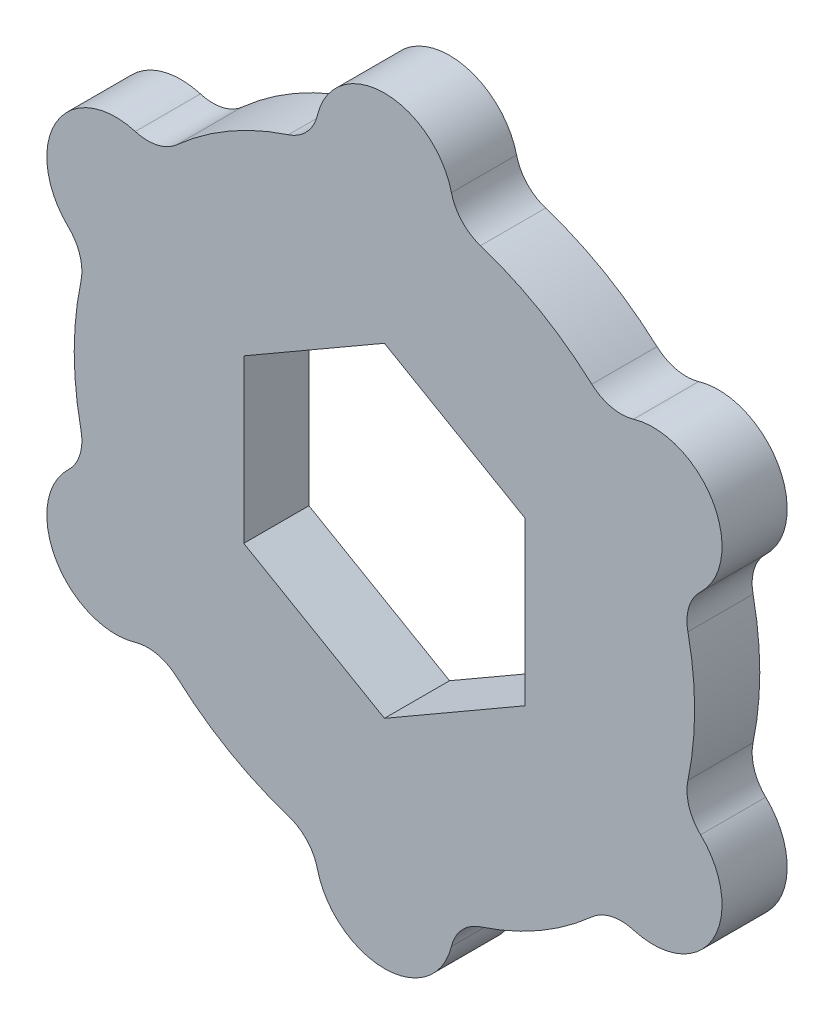
ISO-10303-21;
HEADER;
FILE_DESCRIPTION(('STEP AP214'),'2;1');
FILE_NAME('part.step','',(''),(''),'','','');
FILE_SCHEMA(('AUTOMOTIVE_DESIGN { 1 0 10303 214 1 1 1 1 }'));
ENDSEC;
DATA;
#1=APPLICATION_CONTEXT('core data for automotive mechanical design processes');
#2=APPLICATION_PROTOCOL_DEFINITION('international standard','automotive_design',2000,#1);
#3=PRODUCT_CONTEXT('',#1,'mechanical');
#4=PRODUCT('Part','Part','',(#3));
#5=PRODUCT_RELATED_PRODUCT_CATEGORY('part','',(#4));
#6=PRODUCT_DEFINITION_FORMATION('','',#4);
#7=PRODUCT_DEFINITION_CONTEXT('part definition',#1,'design');
#8=PRODUCT_DEFINITION('design','',#6,#7);
#9=PRODUCT_DEFINITION_SHAPE('','',#8);
#10=(LENGTH_UNIT() NAMED_UNIT(*) SI_UNIT(.MILLI.,.METRE.));
#11=(NAMED_UNIT(*) PLANE_ANGLE_UNIT() SI_UNIT($,.RADIAN.));
#12=(NAMED_UNIT(*) SI_UNIT($,.STERADIAN.) SOLID_ANGLE_UNIT());
#13=UNCERTAINTY_MEASURE_WITH_UNIT(LENGTH_MEASURE(1.E-05),#10,'distance_accuracy_value','');
#14=(GEOMETRIC_REPRESENTATION_CONTEXT(3) GLOBAL_UNCERTAINTY_ASSIGNED_CONTEXT((#13)) GLOBAL_UNIT_ASSIGNED_CONTEXT((#10,
#11,#12)) REPRESENTATION_CONTEXT('',''));
#15=CARTESIAN_POINT('',(0.,0.,0.));
#16=DIRECTION('',(0.,0.,1.));
#17=DIRECTION('',(1.,0.,0.));
#18=AXIS2_PLACEMENT_3D('',#15,#16,#17);
#19=CARTESIAN_POINT('',(0.,7.14375,1.499997));
#20=DIRECTION('',(0.,0.,1.));
#21=DIRECTION('',(1.,0.,0.));
#22=AXIS2_PLACEMENT_3D('',#19,#20,#21);
#23=PLANE('',#22);
#24=CARTESIAN_POINT('',(12.3733379565702,7.14375,1.499997));
#25=DIRECTION('',(0.,0.,1.));
#26=DIRECTION('',(1.,0.,0.));
#27=AXIS2_PLACEMENT_3D('',#24,#25,#26);
#28=CIRCLE('',#27,3.175);
#29=CARTESIAN_POINT('',(14.5612356301264,4.84293954060812,1.499997));
#30=VERTEX_POINT('',#29);
#31=CARTESIAN_POINT('',(11.474726486222,10.1889301958765,1.499997));
#32=VERTEX_POINT('',#31);
#33=EDGE_CURVE('E362',#30,#32,#28,.T.);
#34=ORIENTED_EDGE('',*,*,#33,.T.);
#35=CARTESIAN_POINT('',(10.9032095910805,12.125664800454,1.499997));
#36=DIRECTION('',(0.,0.,1.));
#37=DIRECTION('',(1.,0.,0.));
#38=AXIS2_PLACEMENT_3D('',#35,#36,#37);
#39=CIRCLE('',#38,2.0193);
#40=CARTESIAN_POINT('',(9.55304578657757,10.6241221966595,1.499997));
#41=VERTEX_POINT('',#40);
#42=EDGE_CURVE('E497',#32,#41,#39,.F.);
#43=ORIENTED_EDGE('',*,*,#42,.T.);
#44=CARTESIAN_POINT('',(0.,0.,1.499997));
#45=DIRECTION('',(0.,0.,1.));
#46=DIRECTION('',(1.,0.,0.));
#47=AXIS2_PLACEMENT_3D('',#44,#45,#46);
#48=CIRCLE('',#47,14.2875);
#49=CARTESIAN_POINT('',(4.42423682192846,13.5852414330218,1.499997));
#50=VERTEX_POINT('',#49);
#51=EDGE_CURVE('E319',#41,#50,#48,.T.);
#52=ORIENTED_EDGE('',*,*,#51,.T.);
#53=CARTESIAN_POINT('',(5.04952895942768,15.5052888888889,1.499997));
#54=DIRECTION('',(0.,0.,1.));
#55=DIRECTION('',(1.,0.,0.));
#56=AXIS2_PLACEMENT_3D('',#53,#54,#55);
#57=CIRCLE('',#56,2.0193);
#58=CARTESIAN_POINT('',(3.08650914390445,15.0318697364846,1.499997));
#59=VERTEX_POINT('',#58);
#60=EDGE_CURVE('E68',#50,#59,#57,.F.);
#61=ORIENTED_EDGE('',*,*,#60,.T.);
#62=CARTESIAN_POINT('',(0.,14.2875,1.499997));
#63=DIRECTION('',(0.,0.,1.));
#64=DIRECTION('',(1.,0.,0.));
#65=AXIS2_PLACEMENT_3D('',#62,#63,#64);
#66=CIRCLE('',#65,3.175);
#67=CARTESIAN_POINT('',(-3.08650914390445,15.0318697364846,1.499997));
#68=VERTEX_POINT('',#67);
#69=EDGE_CURVE('E322',#59,#68,#66,.T.);
#70=ORIENTED_EDGE('',*,*,#69,.T.);
#71=CARTESIAN_POINT('',(-5.04952895942768,15.5052888888889,1.499997));
#72=DIRECTION('',(0.,0.,1.));
#73=DIRECTION('',(1.,0.,0.));
#74=AXIS2_PLACEMENT_3D('',#71,#72,#73);
#75=CIRCLE('',#74,2.0193);
#76=CARTESIAN_POINT('',(-4.42423682192846,13.5852414330218,1.499997));
#77=VERTEX_POINT('',#76);
#78=EDGE_CURVE('E551',#68,#77,#75,.F.);
#79=ORIENTED_EDGE('',*,*,#78,.T.);
#80=CARTESIAN_POINT('',(0.,0.,1.499997));
#81=DIRECTION('',(0.,0.,1.));
#82=DIRECTION('',(1.,0.,0.));
#83=AXIS2_PLACEMENT_3D('',#80,#81,#82);
#84=CIRCLE('',#83,14.2875);
#85=CARTESIAN_POINT('',(-9.55304578657758,10.6241221966595,1.499997));
#86=VERTEX_POINT('',#85);
#87=EDGE_CURVE('E326',#77,#86,#84,.T.);
#88=ORIENTED_EDGE('',*,*,#87,.T.);
#89=CARTESIAN_POINT('',(-10.9032095910805,12.125664800454,1.499997));
#90=DIRECTION('',(0.,0.,1.));
#91=DIRECTION('',(1.,0.,0.));
#92=AXIS2_PLACEMENT_3D('',#89,#90,#91);
#93=CIRCLE('',#92,2.0193);
#94=CARTESIAN_POINT('',(-11.474726486222,10.1889301958765,1.499997));
#95=VERTEX_POINT('',#94);
#96=EDGE_CURVE('E11',#86,#95,#93,.F.);
#97=ORIENTED_EDGE('',*,*,#96,.T.);
#98=CARTESIAN_POINT('',(-12.3733379565702,7.14374999999999,1.499997));
#99=DIRECTION('',(0.,0.,1.));
#100=DIRECTION('',(1.,0.,0.));
#101=AXIS2_PLACEMENT_3D('',#98,#99,#100);
#102=CIRCLE('',#101,3.175);
#103=CARTESIAN_POINT('',(-14.5612356301264,4.8429395406081,1.499997));
#104=VERTEX_POINT('',#103);
#105=EDGE_CURVE('E330',#95,#104,#102,.T.);
#106=ORIENTED_EDGE('',*,*,#105,.T.);
#107=CARTESIAN_POINT('',(-15.9527385505082,3.37962408843486,1.499997));
#108=DIRECTION('',(0.,0.,1.));
#109=DIRECTION('',(1.,0.,0.));
#110=AXIS2_PLACEMENT_3D('',#107,#108,#109);
#111=CIRCLE('',#110,2.0193);
#112=CARTESIAN_POINT('',(-13.977282608506,2.96111923636232,1.499997));
#113=VERTEX_POINT('',#112);
#114=EDGE_CURVE('E545',#104,#113,#111,.F.);
#115=ORIENTED_EDGE('',*,*,#114,.T.);
#116=CARTESIAN_POINT('',(0.,0.,1.499997));
#117=DIRECTION('',(0.,0.,1.));
#118=DIRECTION('',(1.,0.,0.));
#119=AXIS2_PLACEMENT_3D('',#116,#117,#118);
#120=CIRCLE('',#119,14.2875);
#121=CARTESIAN_POINT('',(-13.977282608506,-2.96111923636234,1.499997));
#122=VERTEX_POINT('',#121);
#123=EDGE_CURVE('E334',#113,#122,#120,.T.);
#124=ORIENTED_EDGE('',*,*,#123,.T.);
#125=CARTESIAN_POINT('',(-15.9527385505082,-3.37962408843488,1.499997));
#126=DIRECTION('',(0.,0.,1.));
#127=DIRECTION('',(1.,0.,0.));
#128=AXIS2_PLACEMENT_3D('',#125,#126,#127);
#129=CIRCLE('',#128,2.0193);
#130=CARTESIAN_POINT('',(-14.5612356301264,-4.84293954060812,1.499997));
#131=VERTEX_POINT('',#130);
#132=EDGE_CURVE('E539',#122,#131,#129,.F.);
#133=ORIENTED_EDGE('',*,*,#132,.T.);
#134=CARTESIAN_POINT('',(-12.3733379565702,-7.14375000000001,1.499997));
#135=DIRECTION('',(0.,0.,1.));
#136=DIRECTION('',(1.,0.,0.));
#137=AXIS2_PLACEMENT_3D('',#134,#135,#136);
#138=CIRCLE('',#137,3.175);
#139=CARTESIAN_POINT('',(-11.474726486222,-10.1889301958765,1.499997));
#140=VERTEX_POINT('',#139);
#141=EDGE_CURVE('E338',#131,#140,#138,.T.);
#142=ORIENTED_EDGE('',*,*,#141,.T.);
#143=CARTESIAN_POINT('',(-10.9032095910805,-12.125664800454,1.499997));
#144=DIRECTION('',(0.,0.,1.));
#145=DIRECTION('',(1.,0.,0.));
#146=AXIS2_PLACEMENT_3D('',#143,#144,#145);
#147=CIRCLE('',#146,2.0193);
#148=CARTESIAN_POINT('',(-9.55304578657757,-10.6241221966595,1.499997));
#149=VERTEX_POINT('',#148);
#150=EDGE_CURVE('E533',#140,#149,#147,.F.);
#151=ORIENTED_EDGE('',*,*,#150,.T.);
#152=CARTESIAN_POINT('',(0.,0.,1.499997));
#153=DIRECTION('',(0.,0.,1.));
#154=DIRECTION('',(1.,0.,0.));
#155=AXIS2_PLACEMENT_3D('',#152,#153,#154);
#156=CIRCLE('',#155,14.2875);
#157=CARTESIAN_POINT('',(-4.42423682192845,-13.5852414330218,1.499997));
#158=VERTEX_POINT('',#157);
#159=EDGE_CURVE('E342',#149,#158,#156,.T.);
#160=ORIENTED_EDGE('',*,*,#159,.T.);
#161=CARTESIAN_POINT('',(-5.04952895942767,-15.5052888888889,1.499997));
#162=DIRECTION('',(0.,0.,1.));
#163=DIRECTION('',(1.,0.,0.));
#164=AXIS2_PLACEMENT_3D('',#161,#162,#163);
#165=CIRCLE('',#164,2.0193);
#166=CARTESIAN_POINT('',(-3.08650914390445,-15.0318697364847,1.499997));
#167=VERTEX_POINT('',#166);
#168=EDGE_CURVE('E527',#158,#167,#165,.F.);
#169=ORIENTED_EDGE('',*,*,#168,.T.);
#170=CARTESIAN_POINT('',(0.,-14.2875,1.499997));
#171=DIRECTION('',(0.,0.,1.));
#172=DIRECTION('',(1.,0.,0.));
#173=AXIS2_PLACEMENT_3D('',#170,#171,#172);
#174=CIRCLE('',#173,3.175);
#175=CARTESIAN_POINT('',(3.08650914390445,-15.0318697364846,1.499997));
#176=VERTEX_POINT('',#175);
#177=EDGE_CURVE('E346',#167,#176,#174,.T.);
#178=ORIENTED_EDGE('',*,*,#177,.T.);
#179=CARTESIAN_POINT('',(5.04952895942768,-15.5052888888889,1.499997));
#180=DIRECTION('',(0.,0.,1.));
#181=DIRECTION('',(1.,0.,0.));
#182=AXIS2_PLACEMENT_3D('',#179,#180,#181);
#183=CIRCLE('',#182,2.0193);
#184=CARTESIAN_POINT('',(4.42423682192846,-13.5852414330218,1.499997));
#185=VERTEX_POINT('',#184);
#186=EDGE_CURVE('E521',#176,#185,#183,.F.);
#187=ORIENTED_EDGE('',*,*,#186,.T.);
#188=CARTESIAN_POINT('',(0.,0.,1.499997));
#189=DIRECTION('',(0.,0.,1.));
#190=DIRECTION('',(1.,0.,0.));
#191=AXIS2_PLACEMENT_3D('',#188,#189,#190);
#192=CIRCLE('',#191,14.2875);
#193=CARTESIAN_POINT('',(9.55304578657757,-10.6241221966595,1.499997));
#194=VERTEX_POINT('',#193);
#195=EDGE_CURVE('E350',#185,#194,#192,.T.);
#196=ORIENTED_EDGE('',*,*,#195,.T.);
#197=CARTESIAN_POINT('',(10.9032095910805,-12.125664800454,1.499997));
#198=DIRECTION('',(0.,0.,1.));
#199=DIRECTION('',(1.,0.,0.));
#200=AXIS2_PLACEMENT_3D('',#197,#198,#199);
#201=CIRCLE('',#200,2.0193);
#202=CARTESIAN_POINT('',(11.474726486222,-10.1889301958765,1.499997));
#203=VERTEX_POINT('',#202);
#204=EDGE_CURVE('E515',#194,#203,#201,.F.);
#205=ORIENTED_EDGE('',*,*,#204,.T.);
#206=CARTESIAN_POINT('',(12.3733379565702,-7.14375,1.499997));
#207=DIRECTION('',(0.,0.,1.));
#208=DIRECTION('',(1.,0.,0.));
#209=AXIS2_PLACEMENT_3D('',#206,#207,#208);
#210=CIRCLE('',#209,3.175);
#211=CARTESIAN_POINT('',(14.5612356301264,-4.84293954060811,1.499997));
#212=VERTEX_POINT('',#211);
#213=EDGE_CURVE('E354',#203,#212,#210,.T.);
#214=ORIENTED_EDGE('',*,*,#213,.T.);
#215=CARTESIAN_POINT('',(15.9527385505082,-3.37962408843487,1.499997));
#216=DIRECTION('',(0.,0.,1.));
#217=DIRECTION('',(1.,0.,0.));
#218=AXIS2_PLACEMENT_3D('',#215,#216,#217);
#219=CIRCLE('',#218,2.0193);
#220=CARTESIAN_POINT('',(13.977282608506,-2.96111923636233,1.499997));
#221=VERTEX_POINT('',#220);
#222=EDGE_CURVE('E509',#212,#221,#219,.F.);
#223=ORIENTED_EDGE('',*,*,#222,.T.);
#224=CARTESIAN_POINT('',(0.,0.,1.499997));
#225=DIRECTION('',(0.,0.,1.));
#226=DIRECTION('',(1.,0.,0.));
#227=AXIS2_PLACEMENT_3D('',#224,#225,#226);
#228=CIRCLE('',#227,14.2875);
#229=CARTESIAN_POINT('',(13.977282608506,2.96111923636233,1.499997));
#230=VERTEX_POINT('',#229);
#231=EDGE_CURVE('E358',#221,#230,#228,.T.);
#232=ORIENTED_EDGE('',*,*,#231,.T.);
#233=CARTESIAN_POINT('',(15.9527385505082,3.37962408843488,1.499997));
#234=DIRECTION('',(0.,0.,1.));
#235=DIRECTION('',(1.,0.,0.));
#236=AXIS2_PLACEMENT_3D('',#233,#234,#235);
#237=CIRCLE('',#236,2.0193);
#238=EDGE_CURVE('E503',#230,#30,#237,.F.);
#239=ORIENTED_EDGE('',*,*,#238,.T.);
#240=EDGE_LOOP('',(#34,#43,#52,#61,#70,#79,#88,#97,#106,#115,#124,#133,#142,#151,#160,#169,#178,
#187,#196,#205,#214,#223,#232,#239));
#241=FACE_BOUND('',#240,.T.);
#242=DIRECTION('',(-0.866025403784439,-0.5,0.));
#243=VECTOR('',#242,1.);
#244=CARTESIAN_POINT('',(0.,7.47899538708241,1.499997));
#245=LINE('',#244,#243);
#246=CARTESIAN_POINT('',(0.,7.47899538708241,1.499997));
#247=VERTEX_POINT('',#246);
#248=CARTESIAN_POINT('',(-6.477,3.7394976935412,1.499997));
#249=VERTEX_POINT('',#248);
#250=EDGE_CURVE('E256',#247,#249,#245,.T.);
#251=ORIENTED_EDGE('',*,*,#250,.F.);
#252=DIRECTION('',(-0.866025403784439,0.5,0.));
#253=VECTOR('',#252,1.);
#254=CARTESIAN_POINT('',(6.477,3.73949769354121,1.499997));
#255=LINE('',#254,#253);
#256=CARTESIAN_POINT('',(6.477,3.73949769354121,1.499997));
#257=VERTEX_POINT('',#256);
#258=EDGE_CURVE('E245',#257,#247,#255,.T.);
#259=ORIENTED_EDGE('',*,*,#258,.F.);
#260=DIRECTION('',(0.,1.,0.));
#261=VECTOR('',#260,1.);
#262=CARTESIAN_POINT('',(6.477,-3.73949769354121,1.499997));
#263=LINE('',#262,#261);
#264=CARTESIAN_POINT('',(6.477,-3.73949769354121,1.499997));
#265=VERTEX_POINT('',#264);
#266=EDGE_CURVE('E283',#265,#257,#263,.T.);
#267=ORIENTED_EDGE('',*,*,#266,.F.);
#268=DIRECTION('',(0.866025403784439,0.5,0.));
#269=VECTOR('',#268,1.);
#270=CARTESIAN_POINT('',(0.,-7.47899538708241,1.499997));
#271=LINE('',#270,#269);
#272=CARTESIAN_POINT('',(0.,-7.47899538708241,1.499997));
#273=VERTEX_POINT('',#272);
#274=EDGE_CURVE('E279',#273,#265,#271,.T.);
#275=ORIENTED_EDGE('',*,*,#274,.F.);
#276=DIRECTION('',(0.866025403784439,-0.5,0.));
#277=VECTOR('',#276,1.);
#278=CARTESIAN_POINT('',(-6.477,-3.73949769354121,1.499997));
#279=LINE('',#278,#277);
#280=CARTESIAN_POINT('',(-6.477,-3.73949769354121,1.499997));
#281=VERTEX_POINT('',#280);
#282=EDGE_CURVE('E274',#281,#273,#279,.T.);
#283=ORIENTED_EDGE('',*,*,#282,.F.);
#284=DIRECTION('',(0.,-1.,0.));
#285=VECTOR('',#284,1.);
#286=CARTESIAN_POINT('',(-6.477,3.7394976935412,1.499997));
#287=LINE('',#286,#285);
#288=EDGE_CURVE('E270',#249,#281,#287,.T.);
#289=ORIENTED_EDGE('',*,*,#288,.F.);
#290=EDGE_LOOP('',(#251,#259,#267,#275,#283,#289));
#291=FACE_BOUND('',#290,.T.);
#292=ADVANCED_FACE('F45',(#241,#291),#23,.T.);
#293=CARTESIAN_POINT('',(0.,7.14375,-1.499997));
#294=DIRECTION('',(0.,0.,1.));
#295=DIRECTION('',(1.,0.,0.));
#296=AXIS2_PLACEMENT_3D('',#293,#294,#295);
#297=PLANE('',#296);
#298=CARTESIAN_POINT('',(0.,0.,-1.499997));
#299=DIRECTION('',(0.,0.,1.));
#300=DIRECTION('',(1.,0.,0.));
#301=AXIS2_PLACEMENT_3D('',#298,#299,#300);
#302=CIRCLE('',#301,14.2875);
#303=CARTESIAN_POINT('',(9.55304578657757,10.6241221966595,-1.499997));
#304=VERTEX_POINT('',#303);
#305=CARTESIAN_POINT('',(4.42423682192846,13.5852414330218,-1.499997));
#306=VERTEX_POINT('',#305);
#307=EDGE_CURVE('E265',#304,#306,#302,.T.);
#308=ORIENTED_EDGE('',*,*,#307,.F.);
#309=CARTESIAN_POINT('',(10.9032095910805,12.125664800454,-1.499997));
#310=DIRECTION('',(0.,0.,1.));
#311=DIRECTION('',(1.,0.,0.));
#312=AXIS2_PLACEMENT_3D('',#309,#310,#311);
#313=CIRCLE('',#312,2.0193);
#314=CARTESIAN_POINT('',(11.474726486222,10.1889301958765,-1.499997));
#315=VERTEX_POINT('',#314);
#316=EDGE_CURVE('E494',#304,#315,#313,.T.);
#317=ORIENTED_EDGE('',*,*,#316,.T.);
#318=CARTESIAN_POINT('',(12.3733379565702,7.14375,-1.499997));
#319=DIRECTION('',(0.,0.,1.));
#320=DIRECTION('',(1.,0.,0.));
#321=AXIS2_PLACEMENT_3D('',#318,#319,#320);
#322=CIRCLE('',#321,3.175);
#323=CARTESIAN_POINT('',(14.5612356301264,4.84293954060812,-1.499997));
#324=VERTEX_POINT('',#323);
#325=EDGE_CURVE('E323',#324,#315,#322,.T.);
#326=ORIENTED_EDGE('',*,*,#325,.F.);
#327=CARTESIAN_POINT('',(15.9527385505082,3.37962408843488,-1.499997));
#328=DIRECTION('',(0.,0.,1.));
#329=DIRECTION('',(1.,0.,0.));
#330=AXIS2_PLACEMENT_3D('',#327,#328,#329);
#331=CIRCLE('',#330,2.0193);
#332=CARTESIAN_POINT('',(13.977282608506,2.96111923636233,-1.499997));
#333=VERTEX_POINT('',#332);
#334=EDGE_CURVE('E500',#324,#333,#331,.T.);
#335=ORIENTED_EDGE('',*,*,#334,.T.);
#336=CARTESIAN_POINT('',(0.,0.,-1.499997));
#337=DIRECTION('',(0.,0.,1.));
#338=DIRECTION('',(1.,0.,0.));
#339=AXIS2_PLACEMENT_3D('',#336,#337,#338);
#340=CIRCLE('',#339,14.2875);
#341=CARTESIAN_POINT('',(13.977282608506,-2.96111923636233,-1.499997));
#342=VERTEX_POINT('',#341);
#343=EDGE_CURVE('E405',#342,#333,#340,.T.);
#344=ORIENTED_EDGE('',*,*,#343,.F.);
#345=CARTESIAN_POINT('',(15.9527385505082,-3.37962408843487,-1.499997));
#346=DIRECTION('',(0.,0.,1.));
#347=DIRECTION('',(1.,0.,0.));
#348=AXIS2_PLACEMENT_3D('',#345,#346,#347);
#349=CIRCLE('',#348,2.0193);
#350=CARTESIAN_POINT('',(14.5612356301264,-4.84293954060811,-1.499997));
#351=VERTEX_POINT('',#350);
#352=EDGE_CURVE('E506',#342,#351,#349,.T.);
#353=ORIENTED_EDGE('',*,*,#352,.T.);
#354=CARTESIAN_POINT('',(12.3733379565702,-7.14375,-1.499997));
#355=DIRECTION('',(0.,0.,1.));
#356=DIRECTION('',(1.,0.,0.));
#357=AXIS2_PLACEMENT_3D('',#354,#355,#356);
#358=CIRCLE('',#357,3.175);
#359=CARTESIAN_POINT('',(11.474726486222,-10.1889301958765,-1.499997));
#360=VERTEX_POINT('',#359);
#361=EDGE_CURVE('E401',#360,#351,#358,.T.);
#362=ORIENTED_EDGE('',*,*,#361,.F.);
#363=CARTESIAN_POINT('',(10.9032095910805,-12.125664800454,-1.499997));
#364=DIRECTION('',(0.,0.,1.));
#365=DIRECTION('',(1.,0.,0.));
#366=AXIS2_PLACEMENT_3D('',#363,#364,#365);
#367=CIRCLE('',#366,2.0193);
#368=CARTESIAN_POINT('',(9.55304578657757,-10.6241221966595,-1.499997));
#369=VERTEX_POINT('',#368);
#370=EDGE_CURVE('E512',#360,#369,#367,.T.);
#371=ORIENTED_EDGE('',*,*,#370,.T.);
#372=CARTESIAN_POINT('',(0.,0.,-1.499997));
#373=DIRECTION('',(0.,0.,1.));
#374=DIRECTION('',(1.,0.,0.));
#375=AXIS2_PLACEMENT_3D('',#372,#373,#374);
#376=CIRCLE('',#375,14.2875);
#377=CARTESIAN_POINT('',(4.42423682192846,-13.5852414330218,-1.499997));
#378=VERTEX_POINT('',#377);
#379=EDGE_CURVE('E397',#378,#369,#376,.T.);
#380=ORIENTED_EDGE('',*,*,#379,.F.);
#381=CARTESIAN_POINT('',(5.04952895942768,-15.5052888888889,-1.499997));
#382=DIRECTION('',(0.,0.,1.));
#383=DIRECTION('',(1.,0.,0.));
#384=AXIS2_PLACEMENT_3D('',#381,#382,#383);
#385=CIRCLE('',#384,2.0193);
#386=CARTESIAN_POINT('',(3.08650914390445,-15.0318697364846,-1.499997));
#387=VERTEX_POINT('',#386);
#388=EDGE_CURVE('E518',#378,#387,#385,.T.);
#389=ORIENTED_EDGE('',*,*,#388,.T.);
#390=CARTESIAN_POINT('',(0.,-14.2875,-1.499997));
#391=DIRECTION('',(0.,0.,1.));
#392=DIRECTION('',(1.,0.,0.));
#393=AXIS2_PLACEMENT_3D('',#390,#391,#392);
#394=CIRCLE('',#393,3.175);
#395=CARTESIAN_POINT('',(-3.08650914390445,-15.0318697364847,-1.499997));
#396=VERTEX_POINT('',#395);
#397=EDGE_CURVE('E393',#396,#387,#394,.T.);
#398=ORIENTED_EDGE('',*,*,#397,.F.);
#399=CARTESIAN_POINT('',(-5.04952895942767,-15.5052888888889,-1.499997));
#400=DIRECTION('',(0.,0.,1.));
#401=DIRECTION('',(1.,0.,0.));
#402=AXIS2_PLACEMENT_3D('',#399,#400,#401);
#403=CIRCLE('',#402,2.0193);
#404=CARTESIAN_POINT('',(-4.42423682192845,-13.5852414330218,-1.499997));
#405=VERTEX_POINT('',#404);
#406=EDGE_CURVE('E524',#396,#405,#403,.T.);
#407=ORIENTED_EDGE('',*,*,#406,.T.);
#408=CARTESIAN_POINT('',(0.,0.,-1.499997));
#409=DIRECTION('',(0.,0.,1.));
#410=DIRECTION('',(1.,0.,0.));
#411=AXIS2_PLACEMENT_3D('',#408,#409,#410);
#412=CIRCLE('',#411,14.2875);
#413=CARTESIAN_POINT('',(-9.55304578657757,-10.6241221966595,-1.499997));
#414=VERTEX_POINT('',#413);
#415=EDGE_CURVE('E389',#414,#405,#412,.T.);
#416=ORIENTED_EDGE('',*,*,#415,.F.);
#417=CARTESIAN_POINT('',(-10.9032095910805,-12.125664800454,-1.499997));
#418=DIRECTION('',(0.,0.,1.));
#419=DIRECTION('',(1.,0.,0.));
#420=AXIS2_PLACEMENT_3D('',#417,#418,#419);
#421=CIRCLE('',#420,2.0193);
#422=CARTESIAN_POINT('',(-11.474726486222,-10.1889301958765,-1.499997));
#423=VERTEX_POINT('',#422);
#424=EDGE_CURVE('E530',#414,#423,#421,.T.);
#425=ORIENTED_EDGE('',*,*,#424,.T.);
#426=CARTESIAN_POINT('',(-12.3733379565702,-7.14375000000001,-1.499997));
#427=DIRECTION('',(0.,0.,1.));
#428=DIRECTION('',(1.,0.,0.));
#429=AXIS2_PLACEMENT_3D('',#426,#427,#428);
#430=CIRCLE('',#429,3.175);
#431=CARTESIAN_POINT('',(-14.5612356301264,-4.84293954060812,-1.499997));
#432=VERTEX_POINT('',#431);
#433=EDGE_CURVE('E385',#432,#423,#430,.T.);
#434=ORIENTED_EDGE('',*,*,#433,.F.);
#435=CARTESIAN_POINT('',(-15.9527385505082,-3.37962408843488,-1.499997));
#436=DIRECTION('',(0.,0.,1.));
#437=DIRECTION('',(1.,0.,0.));
#438=AXIS2_PLACEMENT_3D('',#435,#436,#437);
#439=CIRCLE('',#438,2.0193);
#440=CARTESIAN_POINT('',(-13.977282608506,-2.96111923636234,-1.499997));
#441=VERTEX_POINT('',#440);
#442=EDGE_CURVE('E536',#432,#441,#439,.T.);
#443=ORIENTED_EDGE('',*,*,#442,.T.);
#444=CARTESIAN_POINT('',(0.,0.,-1.499997));
#445=DIRECTION('',(0.,0.,1.));
#446=DIRECTION('',(1.,0.,0.));
#447=AXIS2_PLACEMENT_3D('',#444,#445,#446);
#448=CIRCLE('',#447,14.2875);
#449=CARTESIAN_POINT('',(-13.977282608506,2.96111923636232,-1.499997));
#450=VERTEX_POINT('',#449);
#451=EDGE_CURVE('E381',#450,#441,#448,.T.);
#452=ORIENTED_EDGE('',*,*,#451,.F.);
#453=CARTESIAN_POINT('',(-15.9527385505082,3.37962408843486,-1.499997));
#454=DIRECTION('',(0.,0.,1.));
#455=DIRECTION('',(1.,0.,0.));
#456=AXIS2_PLACEMENT_3D('',#453,#454,#455);
#457=CIRCLE('',#456,2.0193);
#458=CARTESIAN_POINT('',(-14.5612356301264,4.8429395406081,-1.499997));
#459=VERTEX_POINT('',#458);
#460=EDGE_CURVE('E542',#450,#459,#457,.T.);
#461=ORIENTED_EDGE('',*,*,#460,.T.);
#462=CARTESIAN_POINT('',(-12.3733379565702,7.14374999999999,-1.499997));
#463=DIRECTION('',(0.,0.,1.));
#464=DIRECTION('',(1.,0.,0.));
#465=AXIS2_PLACEMENT_3D('',#462,#463,#464);
#466=CIRCLE('',#465,3.175);
#467=CARTESIAN_POINT('',(-11.474726486222,10.1889301958765,-1.499997));
#468=VERTEX_POINT('',#467);
#469=EDGE_CURVE('E377',#468,#459,#466,.T.);
#470=ORIENTED_EDGE('',*,*,#469,.F.);
#471=CARTESIAN_POINT('',(-10.9032095910805,12.125664800454,-1.499997));
#472=DIRECTION('',(0.,0.,1.));
#473=DIRECTION('',(1.,0.,0.));
#474=AXIS2_PLACEMENT_3D('',#471,#472,#473);
#475=CIRCLE('',#474,2.0193);
#476=CARTESIAN_POINT('',(-9.55304578657758,10.6241221966595,-1.499997));
#477=VERTEX_POINT('',#476);
#478=EDGE_CURVE('E54',#468,#477,#475,.T.);
#479=ORIENTED_EDGE('',*,*,#478,.T.);
#480=CARTESIAN_POINT('',(0.,0.,-1.499997));
#481=DIRECTION('',(0.,0.,1.));
#482=DIRECTION('',(1.,0.,0.));
#483=AXIS2_PLACEMENT_3D('',#480,#481,#482);
#484=CIRCLE('',#483,14.2875);
#485=CARTESIAN_POINT('',(-4.42423682192846,13.5852414330218,-1.499997));
#486=VERTEX_POINT('',#485);
#487=EDGE_CURVE('E373',#486,#477,#484,.T.);
#488=ORIENTED_EDGE('',*,*,#487,.F.);
#489=CARTESIAN_POINT('',(-5.04952895942768,15.5052888888889,-1.499997));
#490=DIRECTION('',(0.,0.,1.));
#491=DIRECTION('',(1.,0.,0.));
#492=AXIS2_PLACEMENT_3D('',#489,#490,#491);
#493=CIRCLE('',#492,2.0193);
#494=CARTESIAN_POINT('',(-3.08650914390445,15.0318697364846,-1.499997));
#495=VERTEX_POINT('',#494);
#496=EDGE_CURVE('E548',#486,#495,#493,.T.);
#497=ORIENTED_EDGE('',*,*,#496,.T.);
#498=CARTESIAN_POINT('',(0.,14.2875,-1.499997));
#499=DIRECTION('',(0.,0.,1.));
#500=DIRECTION('',(1.,0.,0.));
#501=AXIS2_PLACEMENT_3D('',#498,#499,#500);
#502=CIRCLE('',#501,3.175);
#503=CARTESIAN_POINT('',(3.08650914390445,15.0318697364846,-1.499997));
#504=VERTEX_POINT('',#503);
#505=EDGE_CURVE('E370',#504,#495,#502,.T.);
#506=ORIENTED_EDGE('',*,*,#505,.F.);
#507=CARTESIAN_POINT('',(5.04952895942768,15.5052888888889,-1.499997));
#508=DIRECTION('',(0.,0.,1.));
#509=DIRECTION('',(1.,0.,0.));
#510=AXIS2_PLACEMENT_3D('',#507,#508,#509);
#511=CIRCLE('',#510,2.0193);
#512=EDGE_CURVE('E554',#504,#306,#511,.T.);
#513=ORIENTED_EDGE('',*,*,#512,.T.);
#514=EDGE_LOOP('',(#308,#317,#326,#335,#344,#353,#362,#371,#380,#389,#398,#407,#416,#425,#434,
#443,#452,#461,#470,#479,#488,#497,#506,#513));
#515=FACE_BOUND('',#514,.T.);
#516=DIRECTION('',(-0.866025403784439,0.5,0.));
#517=VECTOR('',#516,1.);
#518=CARTESIAN_POINT('',(6.477,3.73949769354121,-1.499997));
#519=LINE('',#518,#517);
#520=CARTESIAN_POINT('',(6.477,3.73949769354121,-1.499997));
#521=VERTEX_POINT('',#520);
#522=CARTESIAN_POINT('',(0.,7.47899538708241,-1.499997));
#523=VERTEX_POINT('',#522);
#524=EDGE_CURVE('E286',#521,#523,#519,.T.);
#525=ORIENTED_EDGE('',*,*,#524,.T.);
#526=DIRECTION('',(-0.866025403784439,-0.5,0.));
#527=VECTOR('',#526,1.);
#528=CARTESIAN_POINT('',(0.,7.47899538708241,-1.499997));
#529=LINE('',#528,#527);
#530=CARTESIAN_POINT('',(-6.477,3.7394976935412,-1.499997));
#531=VERTEX_POINT('',#530);
#532=EDGE_CURVE('E263',#523,#531,#529,.T.);
#533=ORIENTED_EDGE('',*,*,#532,.T.);
#534=DIRECTION('',(0.,-1.,0.));
#535=VECTOR('',#534,1.);
#536=CARTESIAN_POINT('',(-6.477,3.7394976935412,-1.499997));
#537=LINE('',#536,#535);
#538=CARTESIAN_POINT('',(-6.477,-3.73949769354121,-1.499997));
#539=VERTEX_POINT('',#538);
#540=EDGE_CURVE('E291',#531,#539,#537,.T.);
#541=ORIENTED_EDGE('',*,*,#540,.T.);
#542=DIRECTION('',(0.866025403784439,-0.5,0.));
#543=VECTOR('',#542,1.);
#544=CARTESIAN_POINT('',(-6.477,-3.73949769354121,-1.499997));
#545=LINE('',#544,#543);
#546=CARTESIAN_POINT('',(0.,-7.47899538708241,-1.499997));
#547=VERTEX_POINT('',#546);
#548=EDGE_CURVE('E295',#539,#547,#545,.T.);
#549=ORIENTED_EDGE('',*,*,#548,.T.);
#550=DIRECTION('',(0.866025403784439,0.5,0.));
#551=VECTOR('',#550,1.);
#552=CARTESIAN_POINT('',(0.,-7.47899538708241,-1.499997));
#553=LINE('',#552,#551);
#554=CARTESIAN_POINT('',(6.477,-3.73949769354121,-1.499997));
#555=VERTEX_POINT('',#554);
#556=EDGE_CURVE('E299',#547,#555,#553,.T.);
#557=ORIENTED_EDGE('',*,*,#556,.T.);
#558=DIRECTION('',(0.,1.,0.));
#559=VECTOR('',#558,1.);
#560=CARTESIAN_POINT('',(6.477,-3.73949769354121,-1.499997));
#561=LINE('',#560,#559);
#562=EDGE_CURVE('E257',#555,#521,#561,.T.);
#563=ORIENTED_EDGE('',*,*,#562,.T.);
#564=EDGE_LOOP('',(#525,#533,#541,#549,#557,#563));
#565=FACE_BOUND('',#564,.T.);
#566=ADVANCED_FACE('F563',(#515,#565),#297,.F.);
#567=CARTESIAN_POINT('',(0.,0.,1.499997));
#568=DIRECTION('',(0.,0.,-1.));
#569=DIRECTION('',(-1.,0.,0.));
#570=AXIS2_PLACEMENT_3D('',#567,#568,#569);
#571=CYLINDRICAL_SURFACE('',#570,14.2875);
#572=ORIENTED_EDGE('',*,*,#51,.F.);
#573=DIRECTION('',(0.,0.,-1.));
#574=VECTOR('',#573,1.);
#575=CARTESIAN_POINT('',(9.55304578657757,10.6241221966595,1.499997));
#576=LINE('',#575,#574);
#577=EDGE_CURVE('E414',#41,#304,#576,.T.);
#578=ORIENTED_EDGE('',*,*,#577,.T.);
#579=ORIENTED_EDGE('',*,*,#307,.T.);
#580=DIRECTION('',(0.,0.,-1.));
#581=VECTOR('',#580,1.);
#582=CARTESIAN_POINT('',(4.42423682192846,13.5852414330218,1.499997));
#583=LINE('',#582,#581);
#584=EDGE_CURVE('E366',#306,#50,#583,.F.);
#585=ORIENTED_EDGE('',*,*,#584,.T.);
#586=EDGE_LOOP('',(#572,#578,#579,#585));
#587=FACE_BOUND('',#586,.T.);
#588=ADVANCED_FACE('F655',(#587),#571,.T.);
#589=CARTESIAN_POINT('',(0.,14.2875,1.499997));
#590=DIRECTION('',(0.,0.,-1.));
#591=DIRECTION('',(-1.,0.,0.));
#592=AXIS2_PLACEMENT_3D('',#589,#590,#591);
#593=CYLINDRICAL_SURFACE('',#592,3.175);
#594=ORIENTED_EDGE('',*,*,#505,.T.);
#595=DIRECTION('',(0.,0.,-1.));
#596=VECTOR('',#595,1.);
#597=CARTESIAN_POINT('',(-3.08650914390445,15.0318697364846,1.499997));
#598=LINE('',#597,#596);
#599=EDGE_CURVE('E61',#495,#68,#598,.F.);
#600=ORIENTED_EDGE('',*,*,#599,.T.);
#601=ORIENTED_EDGE('',*,*,#69,.F.);
#602=DIRECTION('',(0.,0.,-1.));
#603=VECTOR('',#602,1.);
#604=CARTESIAN_POINT('',(3.08650914390445,15.0318697364846,1.499997));
#605=LINE('',#604,#603);
#606=EDGE_CURVE('E488',#59,#504,#605,.T.);
#607=ORIENTED_EDGE('',*,*,#606,.T.);
#608=EDGE_LOOP('',(#594,#600,#601,#607));
#609=FACE_BOUND('',#608,.T.);
#610=ADVANCED_FACE('F661',(#609),#593,.T.);
#611=CARTESIAN_POINT('',(0.,0.,1.499997));
#612=DIRECTION('',(0.,0.,-1.));
#613=DIRECTION('',(-1.,0.,0.));
#614=AXIS2_PLACEMENT_3D('',#611,#612,#613);
#615=CYLINDRICAL_SURFACE('',#614,14.2875);
#616=ORIENTED_EDGE('',*,*,#87,.F.);
#617=DIRECTION('',(0.,0.,-1.));
#618=VECTOR('',#617,1.);
#619=CARTESIAN_POINT('',(-4.42423682192845,13.5852414330218,1.499997));
#620=LINE('',#619,#618);
#621=EDGE_CURVE('E484',#77,#486,#620,.T.);
#622=ORIENTED_EDGE('',*,*,#621,.T.);
#623=ORIENTED_EDGE('',*,*,#487,.T.);
#624=DIRECTION('',(0.,0.,-1.));
#625=VECTOR('',#624,1.);
#626=CARTESIAN_POINT('',(-9.55304578657758,10.6241221966595,1.499997));
#627=LINE('',#626,#625);
#628=EDGE_CURVE('E481',#477,#86,#627,.F.);
#629=ORIENTED_EDGE('',*,*,#628,.T.);
#630=EDGE_LOOP('',(#616,#622,#623,#629));
#631=FACE_BOUND('',#630,.T.);
#632=ADVANCED_FACE('F570',(#631),#615,.T.);
#633=CARTESIAN_POINT('',(-12.3733379565702,7.14374999999999,1.499997));
#634=DIRECTION('',(0.,0.,-1.));
#635=DIRECTION('',(-1.,0.,0.));
#636=AXIS2_PLACEMENT_3D('',#633,#634,#635);
#637=CYLINDRICAL_SURFACE('',#636,3.175);
#638=ORIENTED_EDGE('',*,*,#469,.T.);
#639=DIRECTION('',(0.,0.,-1.));
#640=VECTOR('',#639,1.);
#641=CARTESIAN_POINT('',(-14.5612356301264,4.8429395406081,1.499997));
#642=LINE('',#641,#640);
#643=EDGE_CURVE('E478',#459,#104,#642,.F.);
#644=ORIENTED_EDGE('',*,*,#643,.T.);
#645=ORIENTED_EDGE('',*,*,#105,.F.);
#646=DIRECTION('',(0.,0.,-1.));
#647=VECTOR('',#646,1.);
#648=CARTESIAN_POINT('',(-11.474726486222,10.1889301958765,1.499997));
#649=LINE('',#648,#647);
#650=EDGE_CURVE('E474',#95,#468,#649,.T.);
#651=ORIENTED_EDGE('',*,*,#650,.T.);
#652=EDGE_LOOP('',(#638,#644,#645,#651));
#653=FACE_BOUND('',#652,.T.);
#654=ADVANCED_FACE('F576',(#653),#637,.T.);
#655=CARTESIAN_POINT('',(0.,0.,1.499997));
#656=DIRECTION('',(0.,0.,-1.));
#657=DIRECTION('',(-1.,0.,0.));
#658=AXIS2_PLACEMENT_3D('',#655,#656,#657);
#659=CYLINDRICAL_SURFACE('',#658,14.2875);
#660=ORIENTED_EDGE('',*,*,#451,.T.);
#661=DIRECTION('',(0.,0.,-1.));
#662=VECTOR('',#661,1.);
#663=CARTESIAN_POINT('',(-13.977282608506,-2.96111923636234,1.499997));
#664=LINE('',#663,#662);
#665=EDGE_CURVE('E471',#441,#122,#664,.F.);
#666=ORIENTED_EDGE('',*,*,#665,.T.);
#667=ORIENTED_EDGE('',*,*,#123,.F.);
#668=DIRECTION('',(0.,0.,-1.));
#669=VECTOR('',#668,1.);
#670=CARTESIAN_POINT('',(-13.977282608506,2.96111923636232,1.499997));
#671=LINE('',#670,#669);
#672=EDGE_CURVE('E467',#113,#450,#671,.T.);
#673=ORIENTED_EDGE('',*,*,#672,.T.);
#674=EDGE_LOOP('',(#660,#666,#667,#673));
#675=FACE_BOUND('',#674,.T.);
#676=ADVANCED_FACE('F584',(#675),#659,.T.);
#677=CARTESIAN_POINT('',(-12.3733379565702,-7.14375000000001,1.499997));
#678=DIRECTION('',(0.,0.,-1.));
#679=DIRECTION('',(-1.,0.,0.));
#680=AXIS2_PLACEMENT_3D('',#677,#678,#679);
#681=CYLINDRICAL_SURFACE('',#680,3.175);
#682=ORIENTED_EDGE('',*,*,#433,.T.);
#683=DIRECTION('',(0.,0.,-1.));
#684=VECTOR('',#683,1.);
#685=CARTESIAN_POINT('',(-11.474726486222,-10.1889301958765,1.499997));
#686=LINE('',#685,#684);
#687=EDGE_CURVE('E464',#423,#140,#686,.F.);
#688=ORIENTED_EDGE('',*,*,#687,.T.);
#689=ORIENTED_EDGE('',*,*,#141,.F.);
#690=DIRECTION('',(0.,0.,-1.));
#691=VECTOR('',#690,1.);
#692=CARTESIAN_POINT('',(-14.5612356301264,-4.84293954060812,1.499997));
#693=LINE('',#692,#691);
#694=EDGE_CURVE('E460',#131,#432,#693,.T.);
#695=ORIENTED_EDGE('',*,*,#694,.T.);
#696=EDGE_LOOP('',(#682,#688,#689,#695));
#697=FACE_BOUND('',#696,.T.);
#698=ADVANCED_FACE('F593',(#697),#681,.T.);
#699=CARTESIAN_POINT('',(0.,0.,1.499997));
#700=DIRECTION('',(0.,0.,-1.));
#701=DIRECTION('',(-1.,0.,0.));
#702=AXIS2_PLACEMENT_3D('',#699,#700,#701);
#703=CYLINDRICAL_SURFACE('',#702,14.2875);
#704=ORIENTED_EDGE('',*,*,#415,.T.);
#705=DIRECTION('',(0.,0.,-1.));
#706=VECTOR('',#705,1.);
#707=CARTESIAN_POINT('',(-4.42423682192845,-13.5852414330218,1.499997));
#708=LINE('',#707,#706);
#709=EDGE_CURVE('E457',#405,#158,#708,.F.);
#710=ORIENTED_EDGE('',*,*,#709,.T.);
#711=ORIENTED_EDGE('',*,*,#159,.F.);
#712=DIRECTION('',(0.,0.,-1.));
#713=VECTOR('',#712,1.);
#714=CARTESIAN_POINT('',(-9.55304578657757,-10.6241221966595,1.499997));
#715=LINE('',#714,#713);
#716=EDGE_CURVE('E453',#149,#414,#715,.T.);
#717=ORIENTED_EDGE('',*,*,#716,.T.);
#718=EDGE_LOOP('',(#704,#710,#711,#717));
#719=FACE_BOUND('',#718,.T.);
#720=ADVANCED_FACE('F602',(#719),#703,.T.);
#721=CARTESIAN_POINT('',(0.,-14.2875,1.499997));
#722=DIRECTION('',(0.,0.,-1.));
#723=DIRECTION('',(-1.,0.,0.));
#724=AXIS2_PLACEMENT_3D('',#721,#722,#723);
#725=CYLINDRICAL_SURFACE('',#724,3.175);
#726=ORIENTED_EDGE('',*,*,#397,.T.);
#727=DIRECTION('',(0.,0.,-1.));
#728=VECTOR('',#727,1.);
#729=CARTESIAN_POINT('',(3.08650914390445,-15.0318697364846,1.499997));
#730=LINE('',#729,#728);
#731=EDGE_CURVE('E450',#387,#176,#730,.F.);
#732=ORIENTED_EDGE('',*,*,#731,.T.);
#733=ORIENTED_EDGE('',*,*,#177,.F.);
#734=DIRECTION('',(0.,0.,-1.));
#735=VECTOR('',#734,1.);
#736=CARTESIAN_POINT('',(-3.08650914390445,-15.0318697364847,1.499997));
#737=LINE('',#736,#735);
#738=EDGE_CURVE('E446',#167,#396,#737,.T.);
#739=ORIENTED_EDGE('',*,*,#738,.T.);
#740=EDGE_LOOP('',(#726,#732,#733,#739));
#741=FACE_BOUND('',#740,.T.);
#742=ADVANCED_FACE('F611',(#741),#725,.T.);
#743=CARTESIAN_POINT('',(0.,0.,1.499997));
#744=DIRECTION('',(0.,0.,-1.));
#745=DIRECTION('',(-1.,0.,0.));
#746=AXIS2_PLACEMENT_3D('',#743,#744,#745);
#747=CYLINDRICAL_SURFACE('',#746,14.2875);
#748=ORIENTED_EDGE('',*,*,#379,.T.);
#749=DIRECTION('',(0.,0.,-1.));
#750=VECTOR('',#749,1.);
#751=CARTESIAN_POINT('',(9.55304578657757,-10.6241221966595,1.499997));
#752=LINE('',#751,#750);
#753=EDGE_CURVE('E443',#369,#194,#752,.F.);
#754=ORIENTED_EDGE('',*,*,#753,.T.);
#755=ORIENTED_EDGE('',*,*,#195,.F.);
#756=DIRECTION('',(0.,0.,-1.));
#757=VECTOR('',#756,1.);
#758=CARTESIAN_POINT('',(4.42423682192846,-13.5852414330218,1.499997));
#759=LINE('',#758,#757);
#760=EDGE_CURVE('E439',#185,#378,#759,.T.);
#761=ORIENTED_EDGE('',*,*,#760,.T.);
#762=EDGE_LOOP('',(#748,#754,#755,#761));
#763=FACE_BOUND('',#762,.T.);
#764=ADVANCED_FACE('F620',(#763),#747,.T.);
#765=CARTESIAN_POINT('',(12.3733379565702,-7.14375,1.499997));
#766=DIRECTION('',(0.,0.,-1.));
#767=DIRECTION('',(-1.,0.,0.));
#768=AXIS2_PLACEMENT_3D('',#765,#766,#767);
#769=CYLINDRICAL_SURFACE('',#768,3.175);
#770=ORIENTED_EDGE('',*,*,#361,.T.);
#771=DIRECTION('',(0.,0.,-1.));
#772=VECTOR('',#771,1.);
#773=CARTESIAN_POINT('',(14.5612356301264,-4.84293954060811,1.499997));
#774=LINE('',#773,#772);
#775=EDGE_CURVE('E436',#351,#212,#774,.F.);
#776=ORIENTED_EDGE('',*,*,#775,.T.);
#777=ORIENTED_EDGE('',*,*,#213,.F.);
#778=DIRECTION('',(0.,0.,-1.));
#779=VECTOR('',#778,1.);
#780=CARTESIAN_POINT('',(11.474726486222,-10.1889301958765,1.499997));
#781=LINE('',#780,#779);
#782=EDGE_CURVE('E432',#203,#360,#781,.T.);
#783=ORIENTED_EDGE('',*,*,#782,.T.);
#784=EDGE_LOOP('',(#770,#776,#777,#783));
#785=FACE_BOUND('',#784,.T.);
#786=ADVANCED_FACE('F629',(#785),#769,.T.);
#787=CARTESIAN_POINT('',(0.,0.,1.499997));
#788=DIRECTION('',(0.,0.,-1.));
#789=DIRECTION('',(-1.,0.,0.));
#790=AXIS2_PLACEMENT_3D('',#787,#788,#789);
#791=CYLINDRICAL_SURFACE('',#790,14.2875);
#792=ORIENTED_EDGE('',*,*,#343,.T.);
#793=DIRECTION('',(0.,0.,-1.));
#794=VECTOR('',#793,1.);
#795=CARTESIAN_POINT('',(13.977282608506,2.96111923636233,1.499997));
#796=LINE('',#795,#794);
#797=EDGE_CURVE('E429',#333,#230,#796,.F.);
#798=ORIENTED_EDGE('',*,*,#797,.T.);
#799=ORIENTED_EDGE('',*,*,#231,.F.);
#800=DIRECTION('',(0.,0.,-1.));
#801=VECTOR('',#800,1.);
#802=CARTESIAN_POINT('',(13.977282608506,-2.96111923636233,1.499997));
#803=LINE('',#802,#801);
#804=EDGE_CURVE('E425',#221,#342,#803,.T.);
#805=ORIENTED_EDGE('',*,*,#804,.T.);
#806=EDGE_LOOP('',(#792,#798,#799,#805));
#807=FACE_BOUND('',#806,.T.);
#808=ADVANCED_FACE('F638',(#807),#791,.T.);
#809=CARTESIAN_POINT('',(12.3733379565702,7.14375,1.499997));
#810=DIRECTION('',(0.,0.,-1.));
#811=DIRECTION('',(-1.,0.,0.));
#812=AXIS2_PLACEMENT_3D('',#809,#810,#811);
#813=CYLINDRICAL_SURFACE('',#812,3.175);
#814=ORIENTED_EDGE('',*,*,#325,.T.);
#815=DIRECTION('',(0.,0.,-1.));
#816=VECTOR('',#815,1.);
#817=CARTESIAN_POINT('',(11.474726486222,10.1889301958765,1.499997));
#818=LINE('',#817,#816);
#819=EDGE_CURVE('E422',#315,#32,#818,.F.);
#820=ORIENTED_EDGE('',*,*,#819,.T.);
#821=ORIENTED_EDGE('',*,*,#33,.F.);
#822=DIRECTION('',(0.,0.,-1.));
#823=VECTOR('',#822,1.);
#824=CARTESIAN_POINT('',(14.5612356301264,4.84293954060812,1.499997));
#825=LINE('',#824,#823);
#826=EDGE_CURVE('E418',#30,#324,#825,.T.);
#827=ORIENTED_EDGE('',*,*,#826,.T.);
#828=EDGE_LOOP('',(#814,#820,#821,#827));
#829=FACE_BOUND('',#828,.T.);
#830=ADVANCED_FACE('F647',(#829),#813,.T.);
#831=CARTESIAN_POINT('',(6.477,3.73949769354121,1.499997));
#832=DIRECTION('',(-0.5,-0.866025403784439,0.));
#833=DIRECTION('',(0.866025403784439,-0.5,0.));
#834=AXIS2_PLACEMENT_3D('',#831,#832,#833);
#835=PLANE('',#834);
#836=ORIENTED_EDGE('',*,*,#524,.F.);
#837=DIRECTION('',(0.,0.,-1.));
#838=VECTOR('',#837,1.);
#839=CARTESIAN_POINT('',(6.477,3.73949769354121,1.499997));
#840=LINE('',#839,#838);
#841=EDGE_CURVE('E251',#257,#521,#840,.T.);
#842=ORIENTED_EDGE('',*,*,#841,.F.);
#843=ORIENTED_EDGE('',*,*,#258,.T.);
#844=DIRECTION('',(0.,0.,-1.));
#845=VECTOR('',#844,1.);
#846=CARTESIAN_POINT('',(0.,7.47899538708241,1.499997));
#847=LINE('',#846,#845);
#848=EDGE_CURVE('E248',#247,#523,#847,.T.);
#849=ORIENTED_EDGE('',*,*,#848,.T.);
#850=EDGE_LOOP('',(#836,#842,#843,#849));
#851=FACE_BOUND('',#850,.T.);
#852=ADVANCED_FACE('F247',(#851),#835,.T.);
#853=CARTESIAN_POINT('',(0.,7.47899538708241,1.499997));
#854=DIRECTION('',(0.5,-0.866025403784439,0.));
#855=DIRECTION('',(0.866025403784439,0.5,0.));
#856=AXIS2_PLACEMENT_3D('',#853,#854,#855);
#857=PLANE('',#856);
#858=ORIENTED_EDGE('',*,*,#532,.F.);
#859=ORIENTED_EDGE('',*,*,#848,.F.);
#860=ORIENTED_EDGE('',*,*,#250,.T.);
#861=DIRECTION('',(0.,0.,-1.));
#862=VECTOR('',#861,1.);
#863=CARTESIAN_POINT('',(-6.477,3.7394976935412,1.499997));
#864=LINE('',#863,#862);
#865=EDGE_CURVE('E266',#249,#531,#864,.T.);
#866=ORIENTED_EDGE('',*,*,#865,.T.);
#867=EDGE_LOOP('',(#858,#859,#860,#866));
#868=FACE_BOUND('',#867,.T.);
#869=ADVANCED_FACE('F260',(#868),#857,.T.);
#870=CARTESIAN_POINT('',(-6.477,3.7394976935412,1.499997));
#871=DIRECTION('',(1.,0.,0.));
#872=DIRECTION('',(0.,1.,0.));
#873=AXIS2_PLACEMENT_3D('',#870,#871,#872);
#874=PLANE('',#873);
#875=ORIENTED_EDGE('',*,*,#540,.F.);
#876=ORIENTED_EDGE('',*,*,#865,.F.);
#877=ORIENTED_EDGE('',*,*,#288,.T.);
#878=DIRECTION('',(0.,0.,-1.));
#879=VECTOR('',#878,1.);
#880=CARTESIAN_POINT('',(-6.477,-3.73949769354121,1.499997));
#881=LINE('',#880,#879);
#882=EDGE_CURVE('E314',#281,#539,#881,.T.);
#883=ORIENTED_EDGE('',*,*,#882,.T.);
#884=EDGE_LOOP('',(#875,#876,#877,#883));
#885=FACE_BOUND('',#884,.T.);
#886=ADVANCED_FACE('F809',(#885),#874,.T.);
#887=CARTESIAN_POINT('',(-6.477,-3.73949769354121,1.499997));
#888=DIRECTION('',(0.5,0.866025403784439,0.));
#889=DIRECTION('',(-0.866025403784439,0.5,0.));
#890=AXIS2_PLACEMENT_3D('',#887,#888,#889);
#891=PLANE('',#890);
#892=ORIENTED_EDGE('',*,*,#548,.F.);
#893=ORIENTED_EDGE('',*,*,#882,.F.);
#894=ORIENTED_EDGE('',*,*,#282,.T.);
#895=DIRECTION('',(0.,0.,-1.));
#896=VECTOR('',#895,1.);
#897=CARTESIAN_POINT('',(0.,-7.47899538708241,1.499997));
#898=LINE('',#897,#896);
#899=EDGE_CURVE('E311',#273,#547,#898,.T.);
#900=ORIENTED_EDGE('',*,*,#899,.T.);
#901=EDGE_LOOP('',(#892,#893,#894,#900));
#902=FACE_BOUND('',#901,.T.);
#903=ADVANCED_FACE('F800',(#902),#891,.T.);
#904=CARTESIAN_POINT('',(0.,-7.47899538708241,1.499997));
#905=DIRECTION('',(-0.5,0.866025403784439,0.));
#906=DIRECTION('',(-0.866025403784439,-0.5,0.));
#907=AXIS2_PLACEMENT_3D('',#904,#905,#906);
#908=PLANE('',#907);
#909=ORIENTED_EDGE('',*,*,#556,.F.);
#910=ORIENTED_EDGE('',*,*,#899,.F.);
#911=ORIENTED_EDGE('',*,*,#274,.T.);
#912=DIRECTION('',(0.,0.,-1.));
#913=VECTOR('',#912,1.);
#914=CARTESIAN_POINT('',(6.477,-3.73949769354121,1.499997));
#915=LINE('',#914,#913);
#916=EDGE_CURVE('E308',#265,#555,#915,.T.);
#917=ORIENTED_EDGE('',*,*,#916,.T.);
#918=EDGE_LOOP('',(#909,#910,#911,#917));
#919=FACE_BOUND('',#918,.T.);
#920=ADVANCED_FACE('F791',(#919),#908,.T.);
#921=CARTESIAN_POINT('',(6.477,-3.73949769354121,1.499997));
#922=DIRECTION('',(-1.,0.,0.));
#923=DIRECTION('',(0.,-1.,0.));
#924=AXIS2_PLACEMENT_3D('',#921,#922,#923);
#925=PLANE('',#924);
#926=ORIENTED_EDGE('',*,*,#562,.F.);
#927=ORIENTED_EDGE('',*,*,#916,.F.);
#928=ORIENTED_EDGE('',*,*,#266,.T.);
#929=ORIENTED_EDGE('',*,*,#841,.T.);
#930=EDGE_LOOP('',(#926,#927,#928,#929));
#931=FACE_BOUND('',#930,.T.);
#932=ADVANCED_FACE('F708',(#931),#925,.T.);
#933=CARTESIAN_POINT('',(10.9032095910805,12.125664800454,1.499997));
#934=DIRECTION('',(0.,0.,1.));
#935=DIRECTION('',(1.,0.,0.));
#936=AXIS2_PLACEMENT_3D('',#933,#934,#935);
#937=CYLINDRICAL_SURFACE('',#936,2.0193);
#938=ORIENTED_EDGE('',*,*,#42,.F.);
#939=ORIENTED_EDGE('',*,*,#819,.F.);
#940=ORIENTED_EDGE('',*,*,#316,.F.);
#941=ORIENTED_EDGE('',*,*,#577,.F.);
#942=EDGE_LOOP('',(#938,#939,#940,#941));
#943=FACE_BOUND('',#942,.T.);
#944=ADVANCED_FACE('F651',(#943),#937,.F.);
#945=CARTESIAN_POINT('',(15.9527385505082,3.37962408843488,1.499997));
#946=DIRECTION('',(0.,0.,1.));
#947=DIRECTION('',(1.,0.,0.));
#948=AXIS2_PLACEMENT_3D('',#945,#946,#947);
#949=CYLINDRICAL_SURFACE('',#948,2.0193);
#950=ORIENTED_EDGE('',*,*,#238,.F.);
#951=ORIENTED_EDGE('',*,*,#797,.F.);
#952=ORIENTED_EDGE('',*,*,#334,.F.);
#953=ORIENTED_EDGE('',*,*,#826,.F.);
#954=EDGE_LOOP('',(#950,#951,#952,#953));
#955=FACE_BOUND('',#954,.T.);
#956=ADVANCED_FACE('F642',(#955),#949,.F.);
#957=CARTESIAN_POINT('',(15.9527385505082,-3.37962408843487,1.499997));
#958=DIRECTION('',(0.,0.,1.));
#959=DIRECTION('',(1.,0.,0.));
#960=AXIS2_PLACEMENT_3D('',#957,#958,#959);
#961=CYLINDRICAL_SURFACE('',#960,2.0193);
#962=ORIENTED_EDGE('',*,*,#222,.F.);
#963=ORIENTED_EDGE('',*,*,#775,.F.);
#964=ORIENTED_EDGE('',*,*,#352,.F.);
#965=ORIENTED_EDGE('',*,*,#804,.F.);
#966=EDGE_LOOP('',(#962,#963,#964,#965));
#967=FACE_BOUND('',#966,.T.);
#968=ADVANCED_FACE('F633',(#967),#961,.F.);
#969=CARTESIAN_POINT('',(10.9032095910805,-12.125664800454,1.499997));
#970=DIRECTION('',(0.,0.,1.));
#971=DIRECTION('',(1.,0.,0.));
#972=AXIS2_PLACEMENT_3D('',#969,#970,#971);
#973=CYLINDRICAL_SURFACE('',#972,2.0193);
#974=ORIENTED_EDGE('',*,*,#204,.F.);
#975=ORIENTED_EDGE('',*,*,#753,.F.);
#976=ORIENTED_EDGE('',*,*,#370,.F.);
#977=ORIENTED_EDGE('',*,*,#782,.F.);
#978=EDGE_LOOP('',(#974,#975,#976,#977));
#979=FACE_BOUND('',#978,.T.);
#980=ADVANCED_FACE('F624',(#979),#973,.F.);
#981=CARTESIAN_POINT('',(5.04952895942768,-15.5052888888889,1.499997));
#982=DIRECTION('',(0.,0.,1.));
#983=DIRECTION('',(1.,0.,0.));
#984=AXIS2_PLACEMENT_3D('',#981,#982,#983);
#985=CYLINDRICAL_SURFACE('',#984,2.0193);
#986=ORIENTED_EDGE('',*,*,#186,.F.);
#987=ORIENTED_EDGE('',*,*,#731,.F.);
#988=ORIENTED_EDGE('',*,*,#388,.F.);
#989=ORIENTED_EDGE('',*,*,#760,.F.);
#990=EDGE_LOOP('',(#986,#987,#988,#989));
#991=FACE_BOUND('',#990,.T.);
#992=ADVANCED_FACE('F615',(#991),#985,.F.);
#993=CARTESIAN_POINT('',(-5.04952895942767,-15.5052888888889,1.499997));
#994=DIRECTION('',(0.,0.,1.));
#995=DIRECTION('',(1.,0.,0.));
#996=AXIS2_PLACEMENT_3D('',#993,#994,#995);
#997=CYLINDRICAL_SURFACE('',#996,2.0193);
#998=ORIENTED_EDGE('',*,*,#168,.F.);
#999=ORIENTED_EDGE('',*,*,#709,.F.);
#1000=ORIENTED_EDGE('',*,*,#406,.F.);
#1001=ORIENTED_EDGE('',*,*,#738,.F.);
#1002=EDGE_LOOP('',(#998,#999,#1000,#1001));
#1003=FACE_BOUND('',#1002,.T.);
#1004=ADVANCED_FACE('F606',(#1003),#997,.F.);
#1005=CARTESIAN_POINT('',(-10.9032095910805,-12.125664800454,1.499997));
#1006=DIRECTION('',(0.,0.,1.));
#1007=DIRECTION('',(1.,0.,0.));
#1008=AXIS2_PLACEMENT_3D('',#1005,#1006,#1007);
#1009=CYLINDRICAL_SURFACE('',#1008,2.0193);
#1010=ORIENTED_EDGE('',*,*,#150,.F.);
#1011=ORIENTED_EDGE('',*,*,#687,.F.);
#1012=ORIENTED_EDGE('',*,*,#424,.F.);
#1013=ORIENTED_EDGE('',*,*,#716,.F.);
#1014=EDGE_LOOP('',(#1010,#1011,#1012,#1013));
#1015=FACE_BOUND('',#1014,.T.);
#1016=ADVANCED_FACE('F597',(#1015),#1009,.F.);
#1017=CARTESIAN_POINT('',(-15.9527385505082,-3.37962408843488,1.499997));
#1018=DIRECTION('',(0.,0.,1.));
#1019=DIRECTION('',(1.,0.,0.));
#1020=AXIS2_PLACEMENT_3D('',#1017,#1018,#1019);
#1021=CYLINDRICAL_SURFACE('',#1020,2.0193);
#1022=ORIENTED_EDGE('',*,*,#132,.F.);
#1023=ORIENTED_EDGE('',*,*,#665,.F.);
#1024=ORIENTED_EDGE('',*,*,#442,.F.);
#1025=ORIENTED_EDGE('',*,*,#694,.F.);
#1026=EDGE_LOOP('',(#1022,#1023,#1024,#1025));
#1027=FACE_BOUND('',#1026,.T.);
#1028=ADVANCED_FACE('F588',(#1027),#1021,.F.);
#1029=CARTESIAN_POINT('',(-15.9527385505082,3.37962408843486,1.499997));
#1030=DIRECTION('',(0.,0.,1.));
#1031=DIRECTION('',(1.,0.,0.));
#1032=AXIS2_PLACEMENT_3D('',#1029,#1030,#1031);
#1033=CYLINDRICAL_SURFACE('',#1032,2.0193);
#1034=ORIENTED_EDGE('',*,*,#114,.F.);
#1035=ORIENTED_EDGE('',*,*,#643,.F.);
#1036=ORIENTED_EDGE('',*,*,#460,.F.);
#1037=ORIENTED_EDGE('',*,*,#672,.F.);
#1038=EDGE_LOOP('',(#1034,#1035,#1036,#1037));
#1039=FACE_BOUND('',#1038,.T.);
#1040=ADVANCED_FACE('F579',(#1039),#1033,.F.);
#1041=CARTESIAN_POINT('',(-5.04952895942768,15.5052888888889,1.499997));
#1042=DIRECTION('',(0.,0.,1.));
#1043=DIRECTION('',(1.,0.,0.));
#1044=AXIS2_PLACEMENT_3D('',#1041,#1042,#1043);
#1045=CYLINDRICAL_SURFACE('',#1044,2.0193);
#1046=ORIENTED_EDGE('',*,*,#78,.F.);
#1047=ORIENTED_EDGE('',*,*,#599,.F.);
#1048=ORIENTED_EDGE('',*,*,#496,.F.);
#1049=ORIENTED_EDGE('',*,*,#621,.F.);
#1050=EDGE_LOOP('',(#1046,#1047,#1048,#1049));
#1051=FACE_BOUND('',#1050,.T.);
#1052=ADVANCED_FACE('F664',(#1051),#1045,.F.);
#1053=CARTESIAN_POINT('',(5.04952895942768,15.5052888888889,1.499997));
#1054=DIRECTION('',(0.,0.,1.));
#1055=DIRECTION('',(1.,0.,0.));
#1056=AXIS2_PLACEMENT_3D('',#1053,#1054,#1055);
#1057=CYLINDRICAL_SURFACE('',#1056,2.0193);
#1058=ORIENTED_EDGE('',*,*,#60,.F.);
#1059=ORIENTED_EDGE('',*,*,#584,.F.);
#1060=ORIENTED_EDGE('',*,*,#512,.F.);
#1061=ORIENTED_EDGE('',*,*,#606,.F.);
#1062=EDGE_LOOP('',(#1058,#1059,#1060,#1061));
#1063=FACE_BOUND('',#1062,.T.);
#1064=ADVANCED_FACE('F658',(#1063),#1057,.F.);
#1065=CARTESIAN_POINT('',(-10.9032095910805,12.125664800454,1.499997));
#1066=DIRECTION('',(0.,0.,1.));
#1067=DIRECTION('',(1.,0.,0.));
#1068=AXIS2_PLACEMENT_3D('',#1065,#1066,#1067);
#1069=CYLINDRICAL_SURFACE('',#1068,2.0193);
#1070=ORIENTED_EDGE('',*,*,#96,.F.);
#1071=ORIENTED_EDGE('',*,*,#628,.F.);
#1072=ORIENTED_EDGE('',*,*,#478,.F.);
#1073=ORIENTED_EDGE('',*,*,#650,.F.);
#1074=EDGE_LOOP('',(#1070,#1071,#1072,#1073));
#1075=FACE_BOUND('',#1074,.T.);
#1076=ADVANCED_FACE('F47',(#1075),#1069,.F.);
#1077=CLOSED_SHELL('',(#292,#566,#588,#610,#632,#654,#676,#698,#720,#742,#764,#786,#808,#830,
#852,#869,#886,#903,#920,#932,#944,#956,#968,#980,#992,#1004,#1016,#1028,#1040,#1052,#1064,#1076));
#1078=MANIFOLD_SOLID_BREP('B2',#1077);
#1079=ADVANCED_BREP_SHAPE_REPRESENTATION('',(#18,#1078),#14);
#1080=SHAPE_DEFINITION_REPRESENTATION(#9,#1079);
ENDSEC;
END-ISO-10303-21;
